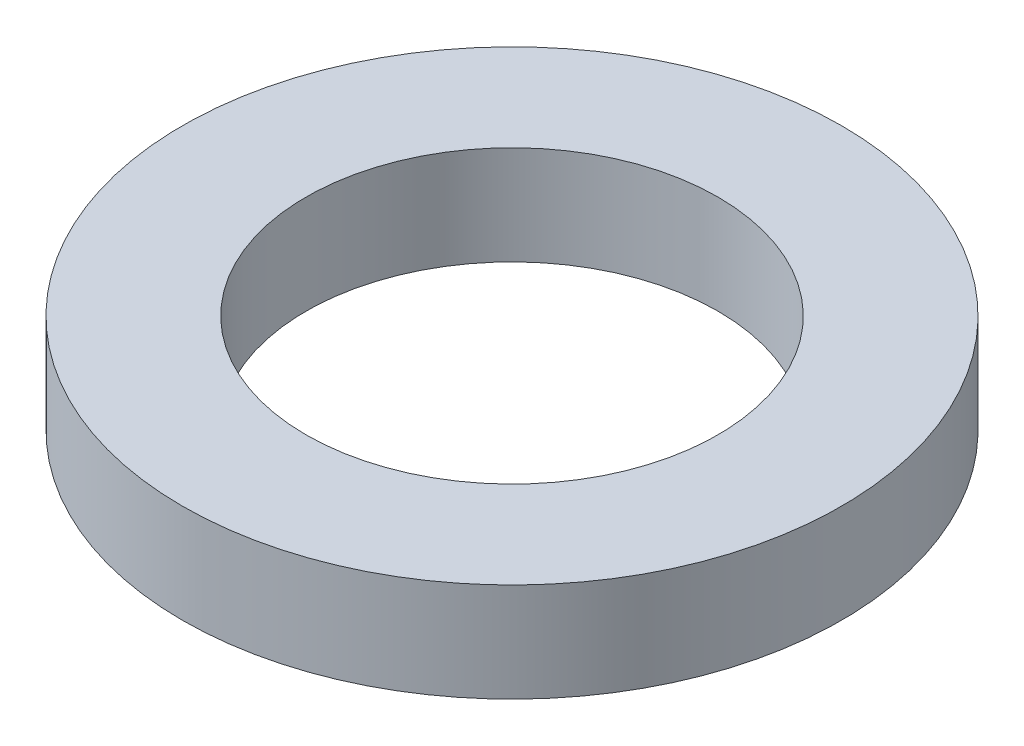
ISO-10303-21;
HEADER;
FILE_DESCRIPTION(('STEP AP214'),'2;1');
FILE_NAME('part.step','',(''),(''),'','','');
FILE_SCHEMA(('AUTOMOTIVE_DESIGN { 1 0 10303 214 1 1 1 1 }'));
ENDSEC;
DATA;
#1=APPLICATION_CONTEXT('core data for automotive mechanical design processes');
#2=APPLICATION_PROTOCOL_DEFINITION('international standard','automotive_design',2000,#1);
#3=PRODUCT_CONTEXT('',#1,'mechanical');
#4=PRODUCT('Part','Part','',(#3));
#5=PRODUCT_RELATED_PRODUCT_CATEGORY('part','',(#4));
#6=PRODUCT_DEFINITION_FORMATION('','',#4);
#7=PRODUCT_DEFINITION_CONTEXT('part definition',#1,'design');
#8=PRODUCT_DEFINITION('design','',#6,#7);
#9=PRODUCT_DEFINITION_SHAPE('','',#8);
#10=(LENGTH_UNIT() NAMED_UNIT(*) SI_UNIT(.MILLI.,.METRE.));
#11=(NAMED_UNIT(*) PLANE_ANGLE_UNIT() SI_UNIT($,.RADIAN.));
#12=(NAMED_UNIT(*) SI_UNIT($,.STERADIAN.) SOLID_ANGLE_UNIT());
#13=UNCERTAINTY_MEASURE_WITH_UNIT(LENGTH_MEASURE(1.E-05),#10,'distance_accuracy_value','');
#14=(GEOMETRIC_REPRESENTATION_CONTEXT(3) GLOBAL_UNCERTAINTY_ASSIGNED_CONTEXT((#13)) GLOBAL_UNIT_ASSIGNED_CONTEXT((#10,
#11,#12)) REPRESENTATION_CONTEXT('',''));
#15=CARTESIAN_POINT('',(0.,0.,0.));
#16=DIRECTION('',(0.,0.,1.));
#17=DIRECTION('',(1.,0.,0.));
#18=AXIS2_PLACEMENT_3D('',#15,#16,#17);
#19=CARTESIAN_POINT('',(0.,0.6,0.));
#20=DIRECTION('',(0.,1.,0.));
#21=DIRECTION('',(0.,0.,1.));
#22=AXIS2_PLACEMENT_3D('',#19,#20,#21);
#23=PLANE('',#22);
#24=CARTESIAN_POINT('',(0.,0.6,0.));
#25=DIRECTION('',(0.,1.,0.));
#26=DIRECTION('',(0.,0.,1.));
#27=AXIS2_PLACEMENT_3D('',#24,#25,#26);
#28=CIRCLE('',#27,2.);
#29=CARTESIAN_POINT('',(0.,0.6,2.));
#30=VERTEX_POINT('',#29);
#31=EDGE_CURVE('E10',#30,#30,#28,.T.);
#32=ORIENTED_EDGE('',*,*,#31,.T.);
#33=EDGE_LOOP('',(#32));
#34=FACE_BOUND('',#33,.T.);
#35=CARTESIAN_POINT('',(0.,0.6,0.));
#36=DIRECTION('',(0.,1.,0.));
#37=DIRECTION('',(0.,0.,1.));
#38=AXIS2_PLACEMENT_3D('',#35,#36,#37);
#39=CIRCLE('',#38,1.25);
#40=CARTESIAN_POINT('',(0.,0.6,1.25));
#41=VERTEX_POINT('',#40);
#42=EDGE_CURVE('E44',#41,#41,#39,.T.);
#43=ORIENTED_EDGE('',*,*,#42,.F.);
#44=EDGE_LOOP('',(#43));
#45=FACE_BOUND('',#44,.T.);
#46=ADVANCED_FACE('F33',(#34,#45),#23,.T.);
#47=CARTESIAN_POINT('',(0.,0.,0.));
#48=DIRECTION('',(0.,1.,0.));
#49=DIRECTION('',(0.,0.,1.));
#50=AXIS2_PLACEMENT_3D('',#47,#48,#49);
#51=PLANE('',#50);
#52=CARTESIAN_POINT('',(0.,0.,0.));
#53=DIRECTION('',(0.,1.,0.));
#54=DIRECTION('',(0.,0.,1.));
#55=AXIS2_PLACEMENT_3D('',#52,#53,#54);
#56=CIRCLE('',#55,2.);
#57=CARTESIAN_POINT('',(0.,0.,2.));
#58=VERTEX_POINT('',#57);
#59=EDGE_CURVE('E37',#58,#58,#56,.T.);
#60=ORIENTED_EDGE('',*,*,#59,.F.);
#61=EDGE_LOOP('',(#60));
#62=FACE_BOUND('',#61,.T.);
#63=CARTESIAN_POINT('',(0.,0.,0.));
#64=DIRECTION('',(0.,1.,0.));
#65=DIRECTION('',(0.,0.,1.));
#66=AXIS2_PLACEMENT_3D('',#63,#64,#65);
#67=CIRCLE('',#66,1.25);
#68=CARTESIAN_POINT('',(0.,0.,1.25));
#69=VERTEX_POINT('',#68);
#70=EDGE_CURVE('E46',#69,#69,#67,.T.);
#71=ORIENTED_EDGE('',*,*,#70,.T.);
#72=EDGE_LOOP('',(#71));
#73=FACE_BOUND('',#72,.T.);
#74=ADVANCED_FACE('F56',(#62,#73),#51,.F.);
#75=CARTESIAN_POINT('',(0.,0.6,0.));
#76=DIRECTION('',(0.,-1.,0.));
#77=DIRECTION('',(0.,0.,-1.));
#78=AXIS2_PLACEMENT_3D('',#75,#76,#77);
#79=CYLINDRICAL_SURFACE('',#78,2.);
#80=ORIENTED_EDGE('',*,*,#31,.F.);
#81=EDGE_LOOP('',(#80));
#82=FACE_BOUND('',#81,.T.);
#83=ORIENTED_EDGE('',*,*,#59,.T.);
#84=EDGE_LOOP('',(#83));
#85=FACE_BOUND('',#84,.T.);
#86=ADVANCED_FACE('F35',(#82,#85),#79,.T.);
#87=CARTESIAN_POINT('',(0.,0.6,0.));
#88=DIRECTION('',(0.,-1.,0.));
#89=DIRECTION('',(0.,0.,-1.));
#90=AXIS2_PLACEMENT_3D('',#87,#88,#89);
#91=CYLINDRICAL_SURFACE('',#90,1.25);
#92=ORIENTED_EDGE('',*,*,#42,.T.);
#93=EDGE_LOOP('',(#92));
#94=FACE_BOUND('',#93,.T.);
#95=ORIENTED_EDGE('',*,*,#70,.F.);
#96=EDGE_LOOP('',(#95));
#97=FACE_BOUND('',#96,.T.);
#98=ADVANCED_FACE('F52',(#94,#97),#91,.F.);
#99=CLOSED_SHELL('',(#46,#74,#86,#98));
#100=MANIFOLD_SOLID_BREP('B2',#99);
#101=ADVANCED_BREP_SHAPE_REPRESENTATION('',(#18,#100),#14);
#102=SHAPE_DEFINITION_REPRESENTATION(#9,#101);
ENDSEC;
END-ISO-10303-21;
